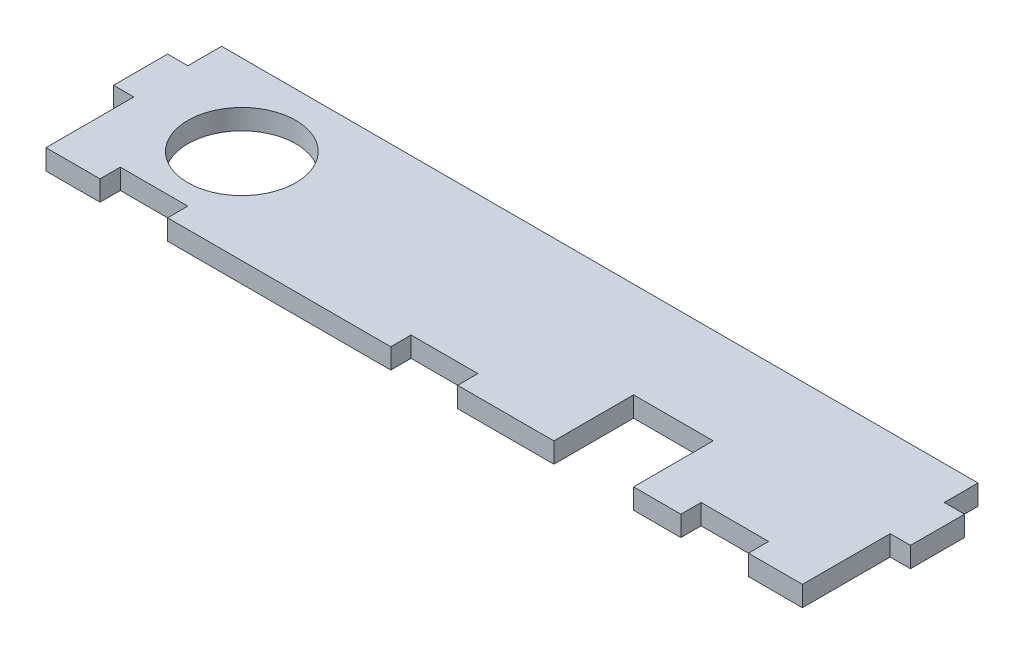
ISO-10303-21;
HEADER;
FILE_DESCRIPTION(('STEP AP214'),'2;1');
FILE_NAME('part.step','',(''),(''),'','','');
FILE_SCHEMA(('AUTOMOTIVE_DESIGN { 1 0 10303 214 1 1 1 1 }'));
ENDSEC;
DATA;
#1=APPLICATION_CONTEXT('core data for automotive mechanical design processes');
#2=APPLICATION_PROTOCOL_DEFINITION('international standard','automotive_design',2000,#1);
#3=PRODUCT_CONTEXT('',#1,'mechanical');
#4=PRODUCT('Part','Part','',(#3));
#5=PRODUCT_RELATED_PRODUCT_CATEGORY('part','',(#4));
#6=PRODUCT_DEFINITION_FORMATION('','',#4);
#7=PRODUCT_DEFINITION_CONTEXT('part definition',#1,'design');
#8=PRODUCT_DEFINITION('design','',#6,#7);
#9=PRODUCT_DEFINITION_SHAPE('','',#8);
#10=(LENGTH_UNIT() NAMED_UNIT(*) SI_UNIT(.MILLI.,.METRE.));
#11=(NAMED_UNIT(*) PLANE_ANGLE_UNIT() SI_UNIT($,.RADIAN.));
#12=(NAMED_UNIT(*) SI_UNIT($,.STERADIAN.) SOLID_ANGLE_UNIT());
#13=UNCERTAINTY_MEASURE_WITH_UNIT(LENGTH_MEASURE(1.E-05),#10,'distance_accuracy_value','');
#14=(GEOMETRIC_REPRESENTATION_CONTEXT(3) GLOBAL_UNCERTAINTY_ASSIGNED_CONTEXT((#13)) GLOBAL_UNIT_ASSIGNED_CONTEXT((#10,
#11,#12)) REPRESENTATION_CONTEXT('',''));
#15=CARTESIAN_POINT('',(0.,0.,0.));
#16=DIRECTION('',(0.,0.,1.));
#17=DIRECTION('',(1.,0.,0.));
#18=AXIS2_PLACEMENT_3D('',#15,#16,#17);
#19=CARTESIAN_POINT('',(0.,3.,0.));
#20=DIRECTION('',(0.,1.,0.));
#21=DIRECTION('',(0.,0.,1.));
#22=AXIS2_PLACEMENT_3D('',#19,#20,#21);
#23=PLANE('',#22);
#24=DIRECTION('',(1.,0.,0.));
#25=VECTOR('',#24,1.);
#26=CARTESIAN_POINT('',(1119.40812578582,3.,2442.39366866363));
#27=LINE('',#26,#25);
#28=CARTESIAN_POINT('',(1109.40812578582,3.,2442.39366866363));
#29=VERTEX_POINT('',#28);
#30=CARTESIAN_POINT('',(1119.40812578582,3.,2442.39366866363));
#31=VERTEX_POINT('',#30);
#32=EDGE_CURVE('E307',#29,#31,#27,.T.);
#33=ORIENTED_EDGE('',*,*,#32,.T.);
#34=DIRECTION('',(0.,0.,1.));
#35=VECTOR('',#34,1.);
#36=CARTESIAN_POINT('',(1119.40812578582,3.,2445.39366866363));
#37=LINE('',#36,#35);
#38=CARTESIAN_POINT('',(1119.40812578582,3.,2445.39366866363));
#39=VERTEX_POINT('',#38);
#40=EDGE_CURVE('E155',#31,#39,#37,.T.);
#41=ORIENTED_EDGE('',*,*,#40,.T.);
#42=DIRECTION('',(1.,0.,0.));
#43=VECTOR('',#42,1.);
#44=CARTESIAN_POINT('',(1119.40812578582,3.,2445.39366866363));
#45=LINE('',#44,#43);
#46=CARTESIAN_POINT('',(1152.45812578582,3.,2445.39366866363));
#47=VERTEX_POINT('',#46);
#48=EDGE_CURVE('E382',#39,#47,#45,.T.);
#49=ORIENTED_EDGE('',*,*,#48,.T.);
#50=DIRECTION('',(0.,0.,-1.));
#51=VECTOR('',#50,1.);
#52=CARTESIAN_POINT('',(1152.45812578582,3.,2445.39366866363));
#53=LINE('',#52,#51);
#54=CARTESIAN_POINT('',(1152.45812578582,3.,2442.39366866363));
#55=VERTEX_POINT('',#54);
#56=EDGE_CURVE('E401',#47,#55,#53,.T.);
#57=ORIENTED_EDGE('',*,*,#56,.T.);
#58=DIRECTION('',(1.,0.,0.));
#59=VECTOR('',#58,1.);
#60=CARTESIAN_POINT('',(1152.45812578582,3.,2442.39366866363));
#61=LINE('',#60,#59);
#62=CARTESIAN_POINT('',(1162.35812578582,3.,2442.39366866363));
#63=VERTEX_POINT('',#62);
#64=EDGE_CURVE('E398',#55,#63,#61,.T.);
#65=ORIENTED_EDGE('',*,*,#64,.T.);
#66=DIRECTION('',(0.,0.,1.));
#67=VECTOR('',#66,1.);
#68=CARTESIAN_POINT('',(1162.35812578582,3.,2442.39366866363));
#69=LINE('',#68,#67);
#70=CARTESIAN_POINT('',(1162.35812578582,3.,2445.39366866363));
#71=VERTEX_POINT('',#70);
#72=EDGE_CURVE('E400',#63,#71,#69,.T.);
#73=ORIENTED_EDGE('',*,*,#72,.T.);
#74=DIRECTION('',(1.,0.,0.));
#75=VECTOR('',#74,1.);
#76=CARTESIAN_POINT('',(1162.35812578582,3.,2445.39366866363));
#77=LINE('',#76,#75);
#78=CARTESIAN_POINT('',(1176.60812578582,3.,2445.39366866363));
#79=VERTEX_POINT('',#78);
#80=EDGE_CURVE('E403',#71,#79,#77,.T.);
#81=ORIENTED_EDGE('',*,*,#80,.T.);
#82=DIRECTION('',(0.,0.,-1.));
#83=VECTOR('',#82,1.);
#84=CARTESIAN_POINT('',(1176.60812578582,3.,2433.59366866363));
#85=LINE('',#84,#83);
#86=CARTESIAN_POINT('',(1176.60812578582,3.,2433.59366866363));
#87=VERTEX_POINT('',#86);
#88=EDGE_CURVE('E409',#79,#87,#85,.T.);
#89=ORIENTED_EDGE('',*,*,#88,.T.);
#90=DIRECTION('',(1.,0.,0.));
#91=VECTOR('',#90,1.);
#92=CARTESIAN_POINT('',(1176.60812578582,3.,2433.59366866363));
#93=LINE('',#92,#91);
#94=CARTESIAN_POINT('',(1188.40812578582,3.,2433.59366866363));
#95=VERTEX_POINT('',#94);
#96=EDGE_CURVE('E411',#87,#95,#93,.T.);
#97=ORIENTED_EDGE('',*,*,#96,.T.);
#98=DIRECTION('',(0.,0.,1.));
#99=VECTOR('',#98,1.);
#100=CARTESIAN_POINT('',(1188.40812578582,3.,2433.59366866363));
#101=LINE('',#100,#99);
#102=CARTESIAN_POINT('',(1188.40812578582,3.,2445.39366866363));
#103=VERTEX_POINT('',#102);
#104=EDGE_CURVE('E413',#95,#103,#101,.T.);
#105=ORIENTED_EDGE('',*,*,#104,.T.);
#106=DIRECTION('',(1.,0.,0.));
#107=VECTOR('',#106,1.);
#108=CARTESIAN_POINT('',(1188.40812578582,3.,2445.39366866363));
#109=LINE('',#108,#107);
#110=CARTESIAN_POINT('',(1195.40812578582,3.,2445.39366866363));
#111=VERTEX_POINT('',#110);
#112=EDGE_CURVE('E415',#103,#111,#109,.T.);
#113=ORIENTED_EDGE('',*,*,#112,.T.);
#114=DIRECTION('',(0.,0.,-1.));
#115=VECTOR('',#114,1.);
#116=CARTESIAN_POINT('',(1195.40812578582,3.,2445.39366866363));
#117=LINE('',#116,#115);
#118=CARTESIAN_POINT('',(1195.40812578582,3.,2442.39366866363));
#119=VERTEX_POINT('',#118);
#120=EDGE_CURVE('E417',#111,#119,#117,.T.);
#121=ORIENTED_EDGE('',*,*,#120,.T.);
#122=DIRECTION('',(1.,0.,0.));
#123=VECTOR('',#122,1.);
#124=CARTESIAN_POINT('',(1195.40812578582,3.,2442.39366866363));
#125=LINE('',#124,#123);
#126=CARTESIAN_POINT('',(1205.40812578582,3.,2442.39366866363));
#127=VERTEX_POINT('',#126);
#128=EDGE_CURVE('E419',#119,#127,#125,.T.);
#129=ORIENTED_EDGE('',*,*,#128,.T.);
#130=DIRECTION('',(0.,0.,1.));
#131=VECTOR('',#130,1.);
#132=CARTESIAN_POINT('',(1205.40812578582,3.,2442.39366866363));
#133=LINE('',#132,#131);
#134=CARTESIAN_POINT('',(1205.40812578582,3.,2445.39366866363));
#135=VERTEX_POINT('',#134);
#136=EDGE_CURVE('E421',#127,#135,#133,.T.);
#137=ORIENTED_EDGE('',*,*,#136,.T.);
#138=DIRECTION('',(1.,0.,0.));
#139=VECTOR('',#138,1.);
#140=CARTESIAN_POINT('',(1205.40812578582,3.,2445.39366866363));
#141=LINE('',#140,#139);
#142=CARTESIAN_POINT('',(1213.40812578582,3.,2445.39366866363));
#143=VERTEX_POINT('',#142);
#144=EDGE_CURVE('E423',#135,#143,#141,.T.);
#145=ORIENTED_EDGE('',*,*,#144,.T.);
#146=DIRECTION('',(0.,0.,-1.));
#147=VECTOR('',#146,1.);
#148=CARTESIAN_POINT('',(1213.40812578582,3.,2432.39366866363));
#149=LINE('',#148,#147);
#150=CARTESIAN_POINT('',(1213.40812578582,3.,2432.39366866363));
#151=VERTEX_POINT('',#150);
#152=EDGE_CURVE('E425',#143,#151,#149,.T.);
#153=ORIENTED_EDGE('',*,*,#152,.T.);
#154=DIRECTION('',(1.,0.,0.));
#155=VECTOR('',#154,1.);
#156=CARTESIAN_POINT('',(1213.40812578582,3.,2432.39366866363));
#157=LINE('',#156,#155);
#158=CARTESIAN_POINT('',(1216.40812578582,3.,2432.39366866363));
#159=VERTEX_POINT('',#158);
#160=EDGE_CURVE('E427',#151,#159,#157,.T.);
#161=ORIENTED_EDGE('',*,*,#160,.T.);
#162=DIRECTION('',(0.,0.,-1.));
#163=VECTOR('',#162,1.);
#164=CARTESIAN_POINT('',(1216.40812578582,3.,2432.39366866363));
#165=LINE('',#164,#163);
#166=CARTESIAN_POINT('',(1216.40812578582,3.,2424.39366866363));
#167=VERTEX_POINT('',#166);
#168=EDGE_CURVE('E429',#159,#167,#165,.T.);
#169=ORIENTED_EDGE('',*,*,#168,.T.);
#170=DIRECTION('',(-1.,0.,0.));
#171=VECTOR('',#170,1.);
#172=CARTESIAN_POINT('',(1216.40812578582,3.,2424.39366866363));
#173=LINE('',#172,#171);
#174=CARTESIAN_POINT('',(1213.40812578582,3.,2424.39366866363));
#175=VERTEX_POINT('',#174);
#176=EDGE_CURVE('E431',#167,#175,#173,.T.);
#177=ORIENTED_EDGE('',*,*,#176,.T.);
#178=DIRECTION('',(0.,0.,-1.));
#179=VECTOR('',#178,1.);
#180=CARTESIAN_POINT('',(1213.40812578582,3.,2419.39366866363));
#181=LINE('',#180,#179);
#182=CARTESIAN_POINT('',(1213.40812578582,3.,2419.39366866363));
#183=VERTEX_POINT('',#182);
#184=EDGE_CURVE('E433',#175,#183,#181,.T.);
#185=ORIENTED_EDGE('',*,*,#184,.T.);
#186=DIRECTION('',(-1.,0.,0.));
#187=VECTOR('',#186,1.);
#188=CARTESIAN_POINT('',(1101.40812578582,3.,2419.39366866363));
#189=LINE('',#188,#187);
#190=CARTESIAN_POINT('',(1101.40812578582,3.,2419.39366866363));
#191=VERTEX_POINT('',#190);
#192=EDGE_CURVE('E435',#183,#191,#189,.T.);
#193=ORIENTED_EDGE('',*,*,#192,.T.);
#194=DIRECTION('',(0.,0.,1.));
#195=VECTOR('',#194,1.);
#196=CARTESIAN_POINT('',(1101.40812578582,3.,2419.39366866363));
#197=LINE('',#196,#195);
#198=CARTESIAN_POINT('',(1101.40812578582,3.,2424.39366866363));
#199=VERTEX_POINT('',#198);
#200=EDGE_CURVE('E437',#191,#199,#197,.T.);
#201=ORIENTED_EDGE('',*,*,#200,.T.);
#202=DIRECTION('',(-1.,0.,0.));
#203=VECTOR('',#202,1.);
#204=CARTESIAN_POINT('',(1098.40812578582,3.,2424.39366866363));
#205=LINE('',#204,#203);
#206=CARTESIAN_POINT('',(1098.40812578582,3.,2424.39366866363));
#207=VERTEX_POINT('',#206);
#208=EDGE_CURVE('E439',#199,#207,#205,.T.);
#209=ORIENTED_EDGE('',*,*,#208,.T.);
#210=DIRECTION('',(0.,0.,1.));
#211=VECTOR('',#210,1.);
#212=CARTESIAN_POINT('',(1098.40812578582,3.,2432.39366866363));
#213=LINE('',#212,#211);
#214=CARTESIAN_POINT('',(1098.40812578582,3.,2432.39366866363));
#215=VERTEX_POINT('',#214);
#216=EDGE_CURVE('E441',#207,#215,#213,.T.);
#217=ORIENTED_EDGE('',*,*,#216,.T.);
#218=DIRECTION('',(1.,0.,0.));
#219=VECTOR('',#218,1.);
#220=CARTESIAN_POINT('',(1101.40812578582,3.,2432.39366866363));
#221=LINE('',#220,#219);
#222=CARTESIAN_POINT('',(1101.40812578582,3.,2432.39366866363));
#223=VERTEX_POINT('',#222);
#224=EDGE_CURVE('E234',#215,#223,#221,.T.);
#225=ORIENTED_EDGE('',*,*,#224,.T.);
#226=DIRECTION('',(0.,0.,1.));
#227=VECTOR('',#226,1.);
#228=CARTESIAN_POINT('',(1101.40812578582,3.,2432.39366866363));
#229=LINE('',#228,#227);
#230=CARTESIAN_POINT('',(1101.40812578582,3.,2445.39366866363));
#231=VERTEX_POINT('',#230);
#232=EDGE_CURVE('E228',#223,#231,#229,.T.);
#233=ORIENTED_EDGE('',*,*,#232,.T.);
#234=DIRECTION('',(1.,0.,0.));
#235=VECTOR('',#234,1.);
#236=CARTESIAN_POINT('',(1109.40812578582,3.,2445.39366866363));
#237=LINE('',#236,#235);
#238=CARTESIAN_POINT('',(1109.40812578582,3.,2445.39366866363));
#239=VERTEX_POINT('',#238);
#240=EDGE_CURVE('E232',#231,#239,#237,.T.);
#241=ORIENTED_EDGE('',*,*,#240,.T.);
#242=DIRECTION('',(0.,0.,-1.));
#243=VECTOR('',#242,1.);
#244=CARTESIAN_POINT('',(1109.40812578582,3.,2442.39366866363));
#245=LINE('',#244,#243);
#246=EDGE_CURVE('E52',#239,#29,#245,.T.);
#247=ORIENTED_EDGE('',*,*,#246,.T.);
#248=EDGE_LOOP('',(#33,#41,#49,#57,#65,#73,#81,#89,#97,#105,#113,#121,#129,#137,#145,#153,#161,
#169,#177,#185,#193,#201,#209,#217,#225,#233,#241,#247));
#249=FACE_BOUND('',#248,.T.);
#250=CARTESIAN_POINT('',(1116.40812578582,3.,2431.39366866363));
#251=DIRECTION('',(0.,1.,0.));
#252=DIRECTION('',(0.,0.,1.));
#253=AXIS2_PLACEMENT_3D('',#250,#251,#252);
#254=CIRCLE('',#253,7.99999999999999);
#255=CARTESIAN_POINT('',(1116.40812578582,3.,2439.39366866363));
#256=VERTEX_POINT('',#255);
#257=EDGE_CURVE('E256',#256,#256,#254,.T.);
#258=ORIENTED_EDGE('',*,*,#257,.F.);
#259=EDGE_LOOP('',(#258));
#260=FACE_BOUND('',#259,.T.);
#261=ADVANCED_FACE('F35',(#249,#260),#23,.T.);
#262=CARTESIAN_POINT('',(0.,0.,0.));
#263=DIRECTION('',(0.,1.,0.));
#264=DIRECTION('',(0.,0.,1.));
#265=AXIS2_PLACEMENT_3D('',#262,#263,#264);
#266=PLANE('',#265);
#267=DIRECTION('',(1.,0.,0.));
#268=VECTOR('',#267,1.);
#269=CARTESIAN_POINT('',(1119.40812578582,0.,2442.39366866363));
#270=LINE('',#269,#268);
#271=CARTESIAN_POINT('',(1109.40812578582,0.,2442.39366866363));
#272=VERTEX_POINT('',#271);
#273=CARTESIAN_POINT('',(1119.40812578582,0.,2442.39366866363));
#274=VERTEX_POINT('',#273);
#275=EDGE_CURVE('E252',#272,#274,#270,.T.);
#276=ORIENTED_EDGE('',*,*,#275,.F.);
#277=DIRECTION('',(0.,0.,-1.));
#278=VECTOR('',#277,1.);
#279=CARTESIAN_POINT('',(1109.40812578582,0.,2442.39366866363));
#280=LINE('',#279,#278);
#281=CARTESIAN_POINT('',(1109.40812578582,0.,2445.39366866363));
#282=VERTEX_POINT('',#281);
#283=EDGE_CURVE('E147',#282,#272,#280,.T.);
#284=ORIENTED_EDGE('',*,*,#283,.F.);
#285=DIRECTION('',(1.,0.,0.));
#286=VECTOR('',#285,1.);
#287=CARTESIAN_POINT('',(1109.40812578582,0.,2445.39366866363));
#288=LINE('',#287,#286);
#289=CARTESIAN_POINT('',(1101.40812578582,0.,2445.39366866363));
#290=VERTEX_POINT('',#289);
#291=EDGE_CURVE('E141',#290,#282,#288,.T.);
#292=ORIENTED_EDGE('',*,*,#291,.F.);
#293=DIRECTION('',(0.,0.,1.));
#294=VECTOR('',#293,1.);
#295=CARTESIAN_POINT('',(1101.40812578582,0.,2432.39366866363));
#296=LINE('',#295,#294);
#297=CARTESIAN_POINT('',(1101.40812578582,0.,2432.39366866363));
#298=VERTEX_POINT('',#297);
#299=EDGE_CURVE('E242',#298,#290,#296,.T.);
#300=ORIENTED_EDGE('',*,*,#299,.F.);
#301=DIRECTION('',(1.,0.,0.));
#302=VECTOR('',#301,1.);
#303=CARTESIAN_POINT('',(1101.40812578582,0.,2432.39366866363));
#304=LINE('',#303,#302);
#305=CARTESIAN_POINT('',(1098.40812578582,0.,2432.39366866363));
#306=VERTEX_POINT('',#305);
#307=EDGE_CURVE('E302',#306,#298,#304,.T.);
#308=ORIENTED_EDGE('',*,*,#307,.F.);
#309=DIRECTION('',(0.,0.,1.));
#310=VECTOR('',#309,1.);
#311=CARTESIAN_POINT('',(1098.40812578582,0.,2432.39366866363));
#312=LINE('',#311,#310);
#313=CARTESIAN_POINT('',(1098.40812578582,0.,2424.39366866363));
#314=VERTEX_POINT('',#313);
#315=EDGE_CURVE('E300',#314,#306,#312,.T.);
#316=ORIENTED_EDGE('',*,*,#315,.F.);
#317=DIRECTION('',(-1.,0.,0.));
#318=VECTOR('',#317,1.);
#319=CARTESIAN_POINT('',(1098.40812578582,0.,2424.39366866363));
#320=LINE('',#319,#318);
#321=CARTESIAN_POINT('',(1101.40812578582,0.,2424.39366866363));
#322=VERTEX_POINT('',#321);
#323=EDGE_CURVE('E298',#322,#314,#320,.T.);
#324=ORIENTED_EDGE('',*,*,#323,.F.);
#325=DIRECTION('',(0.,0.,1.));
#326=VECTOR('',#325,1.);
#327=CARTESIAN_POINT('',(1101.40812578582,0.,2419.39366866363));
#328=LINE('',#327,#326);
#329=CARTESIAN_POINT('',(1101.40812578582,0.,2419.39366866363));
#330=VERTEX_POINT('',#329);
#331=EDGE_CURVE('E296',#330,#322,#328,.T.);
#332=ORIENTED_EDGE('',*,*,#331,.F.);
#333=DIRECTION('',(-1.,0.,0.));
#334=VECTOR('',#333,1.);
#335=CARTESIAN_POINT('',(1101.40812578582,0.,2419.39366866363));
#336=LINE('',#335,#334);
#337=CARTESIAN_POINT('',(1213.40812578582,0.,2419.39366866363));
#338=VERTEX_POINT('',#337);
#339=EDGE_CURVE('E294',#338,#330,#336,.T.);
#340=ORIENTED_EDGE('',*,*,#339,.F.);
#341=DIRECTION('',(0.,0.,-1.));
#342=VECTOR('',#341,1.);
#343=CARTESIAN_POINT('',(1213.40812578582,0.,2419.39366866363));
#344=LINE('',#343,#342);
#345=CARTESIAN_POINT('',(1213.40812578582,0.,2424.39366866363));
#346=VERTEX_POINT('',#345);
#347=EDGE_CURVE('E292',#346,#338,#344,.T.);
#348=ORIENTED_EDGE('',*,*,#347,.F.);
#349=DIRECTION('',(-1.,0.,0.));
#350=VECTOR('',#349,1.);
#351=CARTESIAN_POINT('',(1216.40812578582,0.,2424.39366866363));
#352=LINE('',#351,#350);
#353=CARTESIAN_POINT('',(1216.40812578582,0.,2424.39366866363));
#354=VERTEX_POINT('',#353);
#355=EDGE_CURVE('E290',#354,#346,#352,.T.);
#356=ORIENTED_EDGE('',*,*,#355,.F.);
#357=DIRECTION('',(0.,0.,-1.));
#358=VECTOR('',#357,1.);
#359=CARTESIAN_POINT('',(1216.40812578582,0.,2432.39366866363));
#360=LINE('',#359,#358);
#361=CARTESIAN_POINT('',(1216.40812578582,0.,2432.39366866363));
#362=VERTEX_POINT('',#361);
#363=EDGE_CURVE('E288',#362,#354,#360,.T.);
#364=ORIENTED_EDGE('',*,*,#363,.F.);
#365=DIRECTION('',(1.,0.,0.));
#366=VECTOR('',#365,1.);
#367=CARTESIAN_POINT('',(1213.40812578582,0.,2432.39366866363));
#368=LINE('',#367,#366);
#369=CARTESIAN_POINT('',(1213.40812578582,0.,2432.39366866363));
#370=VERTEX_POINT('',#369);
#371=EDGE_CURVE('E286',#370,#362,#368,.T.);
#372=ORIENTED_EDGE('',*,*,#371,.F.);
#373=DIRECTION('',(0.,0.,-1.));
#374=VECTOR('',#373,1.);
#375=CARTESIAN_POINT('',(1213.40812578582,0.,2432.39366866363));
#376=LINE('',#375,#374);
#377=CARTESIAN_POINT('',(1213.40812578582,0.,2445.39366866363));
#378=VERTEX_POINT('',#377);
#379=EDGE_CURVE('E284',#378,#370,#376,.T.);
#380=ORIENTED_EDGE('',*,*,#379,.F.);
#381=DIRECTION('',(1.,0.,0.));
#382=VECTOR('',#381,1.);
#383=CARTESIAN_POINT('',(1205.40812578582,0.,2445.39366866363));
#384=LINE('',#383,#382);
#385=CARTESIAN_POINT('',(1205.40812578582,0.,2445.39366866363));
#386=VERTEX_POINT('',#385);
#387=EDGE_CURVE('E282',#386,#378,#384,.T.);
#388=ORIENTED_EDGE('',*,*,#387,.F.);
#389=DIRECTION('',(0.,0.,1.));
#390=VECTOR('',#389,1.);
#391=CARTESIAN_POINT('',(1205.40812578582,0.,2442.39366866363));
#392=LINE('',#391,#390);
#393=CARTESIAN_POINT('',(1205.40812578582,0.,2442.39366866363));
#394=VERTEX_POINT('',#393);
#395=EDGE_CURVE('E280',#394,#386,#392,.T.);
#396=ORIENTED_EDGE('',*,*,#395,.F.);
#397=DIRECTION('',(1.,0.,0.));
#398=VECTOR('',#397,1.);
#399=CARTESIAN_POINT('',(1195.40812578582,0.,2442.39366866363));
#400=LINE('',#399,#398);
#401=CARTESIAN_POINT('',(1195.40812578582,0.,2442.39366866363));
#402=VERTEX_POINT('',#401);
#403=EDGE_CURVE('E278',#402,#394,#400,.T.);
#404=ORIENTED_EDGE('',*,*,#403,.F.);
#405=DIRECTION('',(0.,0.,-1.));
#406=VECTOR('',#405,1.);
#407=CARTESIAN_POINT('',(1195.40812578582,0.,2445.39366866363));
#408=LINE('',#407,#406);
#409=CARTESIAN_POINT('',(1195.40812578582,0.,2445.39366866363));
#410=VERTEX_POINT('',#409);
#411=EDGE_CURVE('E276',#410,#402,#408,.T.);
#412=ORIENTED_EDGE('',*,*,#411,.F.);
#413=DIRECTION('',(1.,0.,0.));
#414=VECTOR('',#413,1.);
#415=CARTESIAN_POINT('',(1188.40812578582,0.,2445.39366866363));
#416=LINE('',#415,#414);
#417=CARTESIAN_POINT('',(1188.40812578582,0.,2445.39366866363));
#418=VERTEX_POINT('',#417);
#419=EDGE_CURVE('E274',#418,#410,#416,.T.);
#420=ORIENTED_EDGE('',*,*,#419,.F.);
#421=DIRECTION('',(0.,0.,1.));
#422=VECTOR('',#421,1.);
#423=CARTESIAN_POINT('',(1188.40812578582,0.,2433.59366866363));
#424=LINE('',#423,#422);
#425=CARTESIAN_POINT('',(1188.40812578582,0.,2433.59366866363));
#426=VERTEX_POINT('',#425);
#427=EDGE_CURVE('E272',#426,#418,#424,.T.);
#428=ORIENTED_EDGE('',*,*,#427,.F.);
#429=DIRECTION('',(1.,0.,0.));
#430=VECTOR('',#429,1.);
#431=CARTESIAN_POINT('',(1176.60812578582,0.,2433.59366866363));
#432=LINE('',#431,#430);
#433=CARTESIAN_POINT('',(1176.60812578582,0.,2433.59366866363));
#434=VERTEX_POINT('',#433);
#435=EDGE_CURVE('E270',#434,#426,#432,.T.);
#436=ORIENTED_EDGE('',*,*,#435,.F.);
#437=DIRECTION('',(0.,0.,-1.));
#438=VECTOR('',#437,1.);
#439=CARTESIAN_POINT('',(1176.60812578582,0.,2433.59366866363));
#440=LINE('',#439,#438);
#441=CARTESIAN_POINT('',(1176.60812578582,0.,2445.39366866363));
#442=VERTEX_POINT('',#441);
#443=EDGE_CURVE('E268',#442,#434,#440,.T.);
#444=ORIENTED_EDGE('',*,*,#443,.F.);
#445=DIRECTION('',(1.,0.,0.));
#446=VECTOR('',#445,1.);
#447=CARTESIAN_POINT('',(1162.35812578582,0.,2445.39366866363));
#448=LINE('',#447,#446);
#449=CARTESIAN_POINT('',(1162.35812578582,0.,2445.39366866363));
#450=VERTEX_POINT('',#449);
#451=EDGE_CURVE('E266',#450,#442,#448,.T.);
#452=ORIENTED_EDGE('',*,*,#451,.F.);
#453=DIRECTION('',(0.,0.,1.));
#454=VECTOR('',#453,1.);
#455=CARTESIAN_POINT('',(1162.35812578582,0.,2442.39366866363));
#456=LINE('',#455,#454);
#457=CARTESIAN_POINT('',(1162.35812578582,0.,2442.39366866363));
#458=VERTEX_POINT('',#457);
#459=EDGE_CURVE('E264',#458,#450,#456,.T.);
#460=ORIENTED_EDGE('',*,*,#459,.F.);
#461=DIRECTION('',(1.,0.,0.));
#462=VECTOR('',#461,1.);
#463=CARTESIAN_POINT('',(1152.45812578582,0.,2442.39366866363));
#464=LINE('',#463,#462);
#465=CARTESIAN_POINT('',(1152.45812578582,0.,2442.39366866363));
#466=VERTEX_POINT('',#465);
#467=EDGE_CURVE('E262',#466,#458,#464,.T.);
#468=ORIENTED_EDGE('',*,*,#467,.F.);
#469=DIRECTION('',(0.,0.,-1.));
#470=VECTOR('',#469,1.);
#471=CARTESIAN_POINT('',(1152.45812578582,0.,2445.39366866363));
#472=LINE('',#471,#470);
#473=CARTESIAN_POINT('',(1152.45812578582,0.,2445.39366866363));
#474=VERTEX_POINT('',#473);
#475=EDGE_CURVE('E260',#474,#466,#472,.T.);
#476=ORIENTED_EDGE('',*,*,#475,.F.);
#477=DIRECTION('',(1.,0.,0.));
#478=VECTOR('',#477,1.);
#479=CARTESIAN_POINT('',(1119.40812578582,0.,2445.39366866363));
#480=LINE('',#479,#478);
#481=CARTESIAN_POINT('',(1119.40812578582,0.,2445.39366866363));
#482=VERTEX_POINT('',#481);
#483=EDGE_CURVE('E258',#482,#474,#480,.T.);
#484=ORIENTED_EDGE('',*,*,#483,.F.);
#485=DIRECTION('',(0.,0.,1.));
#486=VECTOR('',#485,1.);
#487=CARTESIAN_POINT('',(1119.40812578582,0.,2445.39366866363));
#488=LINE('',#487,#486);
#489=EDGE_CURVE('E255',#274,#482,#488,.T.);
#490=ORIENTED_EDGE('',*,*,#489,.F.);
#491=EDGE_LOOP('',(#276,#284,#292,#300,#308,#316,#324,#332,#340,#348,#356,#364,#372,#380,#388,
#396,#404,#412,#420,#428,#436,#444,#452,#460,#468,#476,#484,#490));
#492=FACE_BOUND('',#491,.T.);
#493=CARTESIAN_POINT('',(1116.40812578582,0.,2431.39366866363));
#494=DIRECTION('',(0.,1.,0.));
#495=DIRECTION('',(0.,0.,1.));
#496=AXIS2_PLACEMENT_3D('',#493,#494,#495);
#497=CIRCLE('',#496,7.99999999999999);
#498=CARTESIAN_POINT('',(1116.40812578582,0.,2439.39366866363));
#499=VERTEX_POINT('',#498);
#500=EDGE_CURVE('E796',#499,#499,#497,.T.);
#501=ORIENTED_EDGE('',*,*,#500,.T.);
#502=EDGE_LOOP('',(#501));
#503=FACE_BOUND('',#502,.T.);
#504=ADVANCED_FACE('F386',(#492,#503),#266,.F.);
#505=CARTESIAN_POINT('',(1119.40812578582,3.,2442.39366866363));
#506=DIRECTION('',(0.,0.,-1.));
#507=DIRECTION('',(-1.,0.,0.));
#508=AXIS2_PLACEMENT_3D('',#505,#506,#507);
#509=PLANE('',#508);
#510=ORIENTED_EDGE('',*,*,#275,.T.);
#511=DIRECTION('',(0.,-1.,0.));
#512=VECTOR('',#511,1.);
#513=CARTESIAN_POINT('',(1119.40812578582,3.,2442.39366866363));
#514=LINE('',#513,#512);
#515=EDGE_CURVE('E11',#31,#274,#514,.T.);
#516=ORIENTED_EDGE('',*,*,#515,.F.);
#517=ORIENTED_EDGE('',*,*,#32,.F.);
#518=DIRECTION('',(0.,-1.,0.));
#519=VECTOR('',#518,1.);
#520=CARTESIAN_POINT('',(1109.40812578582,3.,2442.39366866363));
#521=LINE('',#520,#519);
#522=EDGE_CURVE('E248',#29,#272,#521,.T.);
#523=ORIENTED_EDGE('',*,*,#522,.T.);
#524=EDGE_LOOP('',(#510,#516,#517,#523));
#525=FACE_BOUND('',#524,.T.);
#526=ADVANCED_FACE('F37',(#525),#509,.F.);
#527=CARTESIAN_POINT('',(1119.40812578582,3.,2445.39366866363));
#528=DIRECTION('',(1.,0.,0.));
#529=DIRECTION('',(0.,0.,-1.));
#530=AXIS2_PLACEMENT_3D('',#527,#528,#529);
#531=PLANE('',#530);
#532=ORIENTED_EDGE('',*,*,#489,.T.);
#533=DIRECTION('',(0.,-1.,0.));
#534=VECTOR('',#533,1.);
#535=CARTESIAN_POINT('',(1119.40812578582,3.,2445.39366866363));
#536=LINE('',#535,#534);
#537=EDGE_CURVE('E44',#39,#482,#536,.T.);
#538=ORIENTED_EDGE('',*,*,#537,.F.);
#539=ORIENTED_EDGE('',*,*,#40,.F.);
#540=ORIENTED_EDGE('',*,*,#515,.T.);
#541=EDGE_LOOP('',(#532,#538,#539,#540));
#542=FACE_BOUND('',#541,.T.);
#543=ADVANCED_FACE('F475',(#542),#531,.F.);
#544=CARTESIAN_POINT('',(1119.40812578582,3.,2445.39366866363));
#545=DIRECTION('',(0.,0.,-1.));
#546=DIRECTION('',(-1.,0.,0.));
#547=AXIS2_PLACEMENT_3D('',#544,#545,#546);
#548=PLANE('',#547);
#549=ORIENTED_EDGE('',*,*,#483,.T.);
#550=DIRECTION('',(0.,-1.,0.));
#551=VECTOR('',#550,1.);
#552=CARTESIAN_POINT('',(1152.45812578582,3.,2445.39366866363));
#553=LINE('',#552,#551);
#554=EDGE_CURVE('E374',#47,#474,#553,.T.);
#555=ORIENTED_EDGE('',*,*,#554,.F.);
#556=ORIENTED_EDGE('',*,*,#48,.F.);
#557=ORIENTED_EDGE('',*,*,#537,.T.);
#558=EDGE_LOOP('',(#549,#555,#556,#557));
#559=FACE_BOUND('',#558,.T.);
#560=ADVANCED_FACE('F380',(#559),#548,.F.);
#561=CARTESIAN_POINT('',(1152.45812578582,3.,2445.39366866363));
#562=DIRECTION('',(-1.,0.,0.));
#563=DIRECTION('',(0.,0.,1.));
#564=AXIS2_PLACEMENT_3D('',#561,#562,#563);
#565=PLANE('',#564);
#566=ORIENTED_EDGE('',*,*,#475,.T.);
#567=DIRECTION('',(0.,-1.,0.));
#568=VECTOR('',#567,1.);
#569=CARTESIAN_POINT('',(1152.45812578582,3.,2442.39366866363));
#570=LINE('',#569,#568);
#571=EDGE_CURVE('E371',#55,#466,#570,.T.);
#572=ORIENTED_EDGE('',*,*,#571,.F.);
#573=ORIENTED_EDGE('',*,*,#56,.F.);
#574=ORIENTED_EDGE('',*,*,#554,.T.);
#575=EDGE_LOOP('',(#566,#572,#573,#574));
#576=FACE_BOUND('',#575,.T.);
#577=ADVANCED_FACE('F392',(#576),#565,.F.);
#578=CARTESIAN_POINT('',(1152.45812578582,3.,2442.39366866363));
#579=DIRECTION('',(0.,0.,-1.));
#580=DIRECTION('',(-1.,0.,0.));
#581=AXIS2_PLACEMENT_3D('',#578,#579,#580);
#582=PLANE('',#581);
#583=ORIENTED_EDGE('',*,*,#467,.T.);
#584=DIRECTION('',(0.,-1.,0.));
#585=VECTOR('',#584,1.);
#586=CARTESIAN_POINT('',(1162.35812578582,3.,2442.39366866363));
#587=LINE('',#586,#585);
#588=EDGE_CURVE('E368',#63,#458,#587,.T.);
#589=ORIENTED_EDGE('',*,*,#588,.F.);
#590=ORIENTED_EDGE('',*,*,#64,.F.);
#591=ORIENTED_EDGE('',*,*,#571,.T.);
#592=EDGE_LOOP('',(#583,#589,#590,#591));
#593=FACE_BOUND('',#592,.T.);
#594=ADVANCED_FACE('F396',(#593),#582,.F.);
#595=CARTESIAN_POINT('',(1162.35812578582,3.,2442.39366866363));
#596=DIRECTION('',(1.,0.,0.));
#597=DIRECTION('',(0.,0.,-1.));
#598=AXIS2_PLACEMENT_3D('',#595,#596,#597);
#599=PLANE('',#598);
#600=ORIENTED_EDGE('',*,*,#459,.T.);
#601=DIRECTION('',(0.,-1.,0.));
#602=VECTOR('',#601,1.);
#603=CARTESIAN_POINT('',(1162.35812578582,3.,2445.39366866363));
#604=LINE('',#603,#602);
#605=EDGE_CURVE('E365',#71,#450,#604,.T.);
#606=ORIENTED_EDGE('',*,*,#605,.F.);
#607=ORIENTED_EDGE('',*,*,#72,.F.);
#608=ORIENTED_EDGE('',*,*,#588,.T.);
#609=EDGE_LOOP('',(#600,#606,#607,#608));
#610=FACE_BOUND('',#609,.T.);
#611=ADVANCED_FACE('F488',(#610),#599,.F.);
#612=CARTESIAN_POINT('',(1162.35812578582,3.,2445.39366866363));
#613=DIRECTION('',(0.,0.,-1.));
#614=DIRECTION('',(-1.,0.,0.));
#615=AXIS2_PLACEMENT_3D('',#612,#613,#614);
#616=PLANE('',#615);
#617=ORIENTED_EDGE('',*,*,#451,.T.);
#618=DIRECTION('',(0.,-1.,0.));
#619=VECTOR('',#618,1.);
#620=CARTESIAN_POINT('',(1176.60812578582,3.,2445.39366866363));
#621=LINE('',#620,#619);
#622=EDGE_CURVE('E362',#79,#442,#621,.T.);
#623=ORIENTED_EDGE('',*,*,#622,.F.);
#624=ORIENTED_EDGE('',*,*,#80,.F.);
#625=ORIENTED_EDGE('',*,*,#605,.T.);
#626=EDGE_LOOP('',(#617,#623,#624,#625));
#627=FACE_BOUND('',#626,.T.);
#628=ADVANCED_FACE('F491',(#627),#616,.F.);
#629=CARTESIAN_POINT('',(1176.60812578582,3.,2433.59366866363));
#630=DIRECTION('',(-1.,0.,0.));
#631=DIRECTION('',(0.,0.,1.));
#632=AXIS2_PLACEMENT_3D('',#629,#630,#631);
#633=PLANE('',#632);
#634=ORIENTED_EDGE('',*,*,#443,.T.);
#635=DIRECTION('',(0.,-1.,0.));
#636=VECTOR('',#635,1.);
#637=CARTESIAN_POINT('',(1176.60812578582,3.,2433.59366866363));
#638=LINE('',#637,#636);
#639=EDGE_CURVE('E359',#87,#434,#638,.T.);
#640=ORIENTED_EDGE('',*,*,#639,.F.);
#641=ORIENTED_EDGE('',*,*,#88,.F.);
#642=ORIENTED_EDGE('',*,*,#622,.T.);
#643=EDGE_LOOP('',(#634,#640,#641,#642));
#644=FACE_BOUND('',#643,.T.);
#645=ADVANCED_FACE('F495',(#644),#633,.F.);
#646=CARTESIAN_POINT('',(1176.60812578582,3.,2433.59366866363));
#647=DIRECTION('',(0.,0.,-1.));
#648=DIRECTION('',(-1.,0.,0.));
#649=AXIS2_PLACEMENT_3D('',#646,#647,#648);
#650=PLANE('',#649);
#651=ORIENTED_EDGE('',*,*,#435,.T.);
#652=DIRECTION('',(0.,-1.,0.));
#653=VECTOR('',#652,1.);
#654=CARTESIAN_POINT('',(1188.40812578582,3.,2433.59366866363));
#655=LINE('',#654,#653);
#656=EDGE_CURVE('E356',#95,#426,#655,.T.);
#657=ORIENTED_EDGE('',*,*,#656,.F.);
#658=ORIENTED_EDGE('',*,*,#96,.F.);
#659=ORIENTED_EDGE('',*,*,#639,.T.);
#660=EDGE_LOOP('',(#651,#657,#658,#659));
#661=FACE_BOUND('',#660,.T.);
#662=ADVANCED_FACE('F499',(#661),#650,.F.);
#663=CARTESIAN_POINT('',(1188.40812578582,3.,2433.59366866363));
#664=DIRECTION('',(1.,0.,0.));
#665=DIRECTION('',(0.,0.,-1.));
#666=AXIS2_PLACEMENT_3D('',#663,#664,#665);
#667=PLANE('',#666);
#668=ORIENTED_EDGE('',*,*,#427,.T.);
#669=DIRECTION('',(0.,-1.,0.));
#670=VECTOR('',#669,1.);
#671=CARTESIAN_POINT('',(1188.40812578582,3.,2445.39366866363));
#672=LINE('',#671,#670);
#673=EDGE_CURVE('E353',#103,#418,#672,.T.);
#674=ORIENTED_EDGE('',*,*,#673,.F.);
#675=ORIENTED_EDGE('',*,*,#104,.F.);
#676=ORIENTED_EDGE('',*,*,#656,.T.);
#677=EDGE_LOOP('',(#668,#674,#675,#676));
#678=FACE_BOUND('',#677,.T.);
#679=ADVANCED_FACE('F503',(#678),#667,.F.);
#680=CARTESIAN_POINT('',(1188.40812578582,3.,2445.39366866363));
#681=DIRECTION('',(0.,0.,-1.));
#682=DIRECTION('',(-1.,0.,0.));
#683=AXIS2_PLACEMENT_3D('',#680,#681,#682);
#684=PLANE('',#683);
#685=ORIENTED_EDGE('',*,*,#419,.T.);
#686=DIRECTION('',(0.,-1.,0.));
#687=VECTOR('',#686,1.);
#688=CARTESIAN_POINT('',(1195.40812578582,3.,2445.39366866363));
#689=LINE('',#688,#687);
#690=EDGE_CURVE('E350',#111,#410,#689,.T.);
#691=ORIENTED_EDGE('',*,*,#690,.F.);
#692=ORIENTED_EDGE('',*,*,#112,.F.);
#693=ORIENTED_EDGE('',*,*,#673,.T.);
#694=EDGE_LOOP('',(#685,#691,#692,#693));
#695=FACE_BOUND('',#694,.T.);
#696=ADVANCED_FACE('F507',(#695),#684,.F.);
#697=CARTESIAN_POINT('',(1195.40812578582,3.,2445.39366866363));
#698=DIRECTION('',(-1.,0.,0.));
#699=DIRECTION('',(0.,0.,1.));
#700=AXIS2_PLACEMENT_3D('',#697,#698,#699);
#701=PLANE('',#700);
#702=ORIENTED_EDGE('',*,*,#411,.T.);
#703=DIRECTION('',(0.,-1.,0.));
#704=VECTOR('',#703,1.);
#705=CARTESIAN_POINT('',(1195.40812578582,3.,2442.39366866363));
#706=LINE('',#705,#704);
#707=EDGE_CURVE('E347',#119,#402,#706,.T.);
#708=ORIENTED_EDGE('',*,*,#707,.F.);
#709=ORIENTED_EDGE('',*,*,#120,.F.);
#710=ORIENTED_EDGE('',*,*,#690,.T.);
#711=EDGE_LOOP('',(#702,#708,#709,#710));
#712=FACE_BOUND('',#711,.T.);
#713=ADVANCED_FACE('F511',(#712),#701,.F.);
#714=CARTESIAN_POINT('',(1195.40812578582,3.,2442.39366866363));
#715=DIRECTION('',(0.,0.,-1.));
#716=DIRECTION('',(-1.,0.,0.));
#717=AXIS2_PLACEMENT_3D('',#714,#715,#716);
#718=PLANE('',#717);
#719=ORIENTED_EDGE('',*,*,#403,.T.);
#720=DIRECTION('',(0.,-1.,0.));
#721=VECTOR('',#720,1.);
#722=CARTESIAN_POINT('',(1205.40812578582,3.,2442.39366866363));
#723=LINE('',#722,#721);
#724=EDGE_CURVE('E344',#127,#394,#723,.T.);
#725=ORIENTED_EDGE('',*,*,#724,.F.);
#726=ORIENTED_EDGE('',*,*,#128,.F.);
#727=ORIENTED_EDGE('',*,*,#707,.T.);
#728=EDGE_LOOP('',(#719,#725,#726,#727));
#729=FACE_BOUND('',#728,.T.);
#730=ADVANCED_FACE('F515',(#729),#718,.F.);
#731=CARTESIAN_POINT('',(1205.40812578582,3.,2442.39366866363));
#732=DIRECTION('',(1.,0.,0.));
#733=DIRECTION('',(0.,0.,-1.));
#734=AXIS2_PLACEMENT_3D('',#731,#732,#733);
#735=PLANE('',#734);
#736=ORIENTED_EDGE('',*,*,#395,.T.);
#737=DIRECTION('',(0.,-1.,0.));
#738=VECTOR('',#737,1.);
#739=CARTESIAN_POINT('',(1205.40812578582,3.,2445.39366866363));
#740=LINE('',#739,#738);
#741=EDGE_CURVE('E341',#135,#386,#740,.T.);
#742=ORIENTED_EDGE('',*,*,#741,.F.);
#743=ORIENTED_EDGE('',*,*,#136,.F.);
#744=ORIENTED_EDGE('',*,*,#724,.T.);
#745=EDGE_LOOP('',(#736,#742,#743,#744));
#746=FACE_BOUND('',#745,.T.);
#747=ADVANCED_FACE('F519',(#746),#735,.F.);
#748=CARTESIAN_POINT('',(1205.40812578582,3.,2445.39366866363));
#749=DIRECTION('',(0.,0.,-1.));
#750=DIRECTION('',(-1.,0.,0.));
#751=AXIS2_PLACEMENT_3D('',#748,#749,#750);
#752=PLANE('',#751);
#753=ORIENTED_EDGE('',*,*,#387,.T.);
#754=DIRECTION('',(0.,-1.,0.));
#755=VECTOR('',#754,1.);
#756=CARTESIAN_POINT('',(1213.40812578582,3.,2445.39366866363));
#757=LINE('',#756,#755);
#758=EDGE_CURVE('E338',#143,#378,#757,.T.);
#759=ORIENTED_EDGE('',*,*,#758,.F.);
#760=ORIENTED_EDGE('',*,*,#144,.F.);
#761=ORIENTED_EDGE('',*,*,#741,.T.);
#762=EDGE_LOOP('',(#753,#759,#760,#761));
#763=FACE_BOUND('',#762,.T.);
#764=ADVANCED_FACE('F523',(#763),#752,.F.);
#765=CARTESIAN_POINT('',(1213.40812578582,3.,2432.39366866363));
#766=DIRECTION('',(-1.,0.,0.));
#767=DIRECTION('',(0.,0.,1.));
#768=AXIS2_PLACEMENT_3D('',#765,#766,#767);
#769=PLANE('',#768);
#770=ORIENTED_EDGE('',*,*,#379,.T.);
#771=DIRECTION('',(0.,-1.,0.));
#772=VECTOR('',#771,1.);
#773=CARTESIAN_POINT('',(1213.40812578582,3.,2432.39366866363));
#774=LINE('',#773,#772);
#775=EDGE_CURVE('E335',#151,#370,#774,.T.);
#776=ORIENTED_EDGE('',*,*,#775,.F.);
#777=ORIENTED_EDGE('',*,*,#152,.F.);
#778=ORIENTED_EDGE('',*,*,#758,.T.);
#779=EDGE_LOOP('',(#770,#776,#777,#778));
#780=FACE_BOUND('',#779,.T.);
#781=ADVANCED_FACE('F527',(#780),#769,.F.);
#782=CARTESIAN_POINT('',(1213.40812578582,3.,2432.39366866363));
#783=DIRECTION('',(0.,0.,-1.));
#784=DIRECTION('',(-1.,0.,0.));
#785=AXIS2_PLACEMENT_3D('',#782,#783,#784);
#786=PLANE('',#785);
#787=ORIENTED_EDGE('',*,*,#371,.T.);
#788=DIRECTION('',(0.,-1.,0.));
#789=VECTOR('',#788,1.);
#790=CARTESIAN_POINT('',(1216.40812578582,3.,2432.39366866363));
#791=LINE('',#790,#789);
#792=EDGE_CURVE('E332',#159,#362,#791,.T.);
#793=ORIENTED_EDGE('',*,*,#792,.F.);
#794=ORIENTED_EDGE('',*,*,#160,.F.);
#795=ORIENTED_EDGE('',*,*,#775,.T.);
#796=EDGE_LOOP('',(#787,#793,#794,#795));
#797=FACE_BOUND('',#796,.T.);
#798=ADVANCED_FACE('F531',(#797),#786,.F.);
#799=CARTESIAN_POINT('',(1216.40812578582,3.,2432.39366866363));
#800=DIRECTION('',(-1.,0.,0.));
#801=DIRECTION('',(0.,0.,1.));
#802=AXIS2_PLACEMENT_3D('',#799,#800,#801);
#803=PLANE('',#802);
#804=ORIENTED_EDGE('',*,*,#363,.T.);
#805=DIRECTION('',(0.,-1.,0.));
#806=VECTOR('',#805,1.);
#807=CARTESIAN_POINT('',(1216.40812578582,3.,2424.39366866363));
#808=LINE('',#807,#806);
#809=EDGE_CURVE('E329',#167,#354,#808,.T.);
#810=ORIENTED_EDGE('',*,*,#809,.F.);
#811=ORIENTED_EDGE('',*,*,#168,.F.);
#812=ORIENTED_EDGE('',*,*,#792,.T.);
#813=EDGE_LOOP('',(#804,#810,#811,#812));
#814=FACE_BOUND('',#813,.T.);
#815=ADVANCED_FACE('F535',(#814),#803,.F.);
#816=CARTESIAN_POINT('',(1216.40812578582,3.,2424.39366866363));
#817=DIRECTION('',(0.,0.,1.));
#818=DIRECTION('',(1.,0.,0.));
#819=AXIS2_PLACEMENT_3D('',#816,#817,#818);
#820=PLANE('',#819);
#821=ORIENTED_EDGE('',*,*,#355,.T.);
#822=DIRECTION('',(0.,-1.,0.));
#823=VECTOR('',#822,1.);
#824=CARTESIAN_POINT('',(1213.40812578582,3.,2424.39366866363));
#825=LINE('',#824,#823);
#826=EDGE_CURVE('E326',#175,#346,#825,.T.);
#827=ORIENTED_EDGE('',*,*,#826,.F.);
#828=ORIENTED_EDGE('',*,*,#176,.F.);
#829=ORIENTED_EDGE('',*,*,#809,.T.);
#830=EDGE_LOOP('',(#821,#827,#828,#829));
#831=FACE_BOUND('',#830,.T.);
#832=ADVANCED_FACE('F539',(#831),#820,.F.);
#833=CARTESIAN_POINT('',(1213.40812578582,3.,2419.39366866363));
#834=DIRECTION('',(-1.,0.,0.));
#835=DIRECTION('',(0.,0.,1.));
#836=AXIS2_PLACEMENT_3D('',#833,#834,#835);
#837=PLANE('',#836);
#838=ORIENTED_EDGE('',*,*,#347,.T.);
#839=DIRECTION('',(0.,-1.,0.));
#840=VECTOR('',#839,1.);
#841=CARTESIAN_POINT('',(1213.40812578582,3.,2419.39366866363));
#842=LINE('',#841,#840);
#843=EDGE_CURVE('E323',#183,#338,#842,.T.);
#844=ORIENTED_EDGE('',*,*,#843,.F.);
#845=ORIENTED_EDGE('',*,*,#184,.F.);
#846=ORIENTED_EDGE('',*,*,#826,.T.);
#847=EDGE_LOOP('',(#838,#844,#845,#846));
#848=FACE_BOUND('',#847,.T.);
#849=ADVANCED_FACE('F543',(#848),#837,.F.);
#850=CARTESIAN_POINT('',(1101.40812578582,3.,2419.39366866363));
#851=DIRECTION('',(0.,0.,1.));
#852=DIRECTION('',(1.,0.,0.));
#853=AXIS2_PLACEMENT_3D('',#850,#851,#852);
#854=PLANE('',#853);
#855=ORIENTED_EDGE('',*,*,#339,.T.);
#856=DIRECTION('',(0.,-1.,0.));
#857=VECTOR('',#856,1.);
#858=CARTESIAN_POINT('',(1101.40812578582,3.,2419.39366866363));
#859=LINE('',#858,#857);
#860=EDGE_CURVE('E320',#191,#330,#859,.T.);
#861=ORIENTED_EDGE('',*,*,#860,.F.);
#862=ORIENTED_EDGE('',*,*,#192,.F.);
#863=ORIENTED_EDGE('',*,*,#843,.T.);
#864=EDGE_LOOP('',(#855,#861,#862,#863));
#865=FACE_BOUND('',#864,.T.);
#866=ADVANCED_FACE('F547',(#865),#854,.F.);
#867=CARTESIAN_POINT('',(1101.40812578582,3.,2419.39366866363));
#868=DIRECTION('',(1.,0.,0.));
#869=DIRECTION('',(0.,0.,-1.));
#870=AXIS2_PLACEMENT_3D('',#867,#868,#869);
#871=PLANE('',#870);
#872=ORIENTED_EDGE('',*,*,#331,.T.);
#873=DIRECTION('',(0.,-1.,0.));
#874=VECTOR('',#873,1.);
#875=CARTESIAN_POINT('',(1101.40812578582,3.,2424.39366866363));
#876=LINE('',#875,#874);
#877=EDGE_CURVE('E317',#199,#322,#876,.T.);
#878=ORIENTED_EDGE('',*,*,#877,.F.);
#879=ORIENTED_EDGE('',*,*,#200,.F.);
#880=ORIENTED_EDGE('',*,*,#860,.T.);
#881=EDGE_LOOP('',(#872,#878,#879,#880));
#882=FACE_BOUND('',#881,.T.);
#883=ADVANCED_FACE('F551',(#882),#871,.F.);
#884=CARTESIAN_POINT('',(1098.40812578582,3.,2424.39366866363));
#885=DIRECTION('',(0.,0.,1.));
#886=DIRECTION('',(1.,0.,0.));
#887=AXIS2_PLACEMENT_3D('',#884,#885,#886);
#888=PLANE('',#887);
#889=ORIENTED_EDGE('',*,*,#323,.T.);
#890=DIRECTION('',(0.,-1.,0.));
#891=VECTOR('',#890,1.);
#892=CARTESIAN_POINT('',(1098.40812578582,3.,2424.39366866363));
#893=LINE('',#892,#891);
#894=EDGE_CURVE('E314',#207,#314,#893,.T.);
#895=ORIENTED_EDGE('',*,*,#894,.F.);
#896=ORIENTED_EDGE('',*,*,#208,.F.);
#897=ORIENTED_EDGE('',*,*,#877,.T.);
#898=EDGE_LOOP('',(#889,#895,#896,#897));
#899=FACE_BOUND('',#898,.T.);
#900=ADVANCED_FACE('F555',(#899),#888,.F.);
#901=CARTESIAN_POINT('',(1098.40812578582,3.,2432.39366866363));
#902=DIRECTION('',(1.,0.,0.));
#903=DIRECTION('',(0.,0.,-1.));
#904=AXIS2_PLACEMENT_3D('',#901,#902,#903);
#905=PLANE('',#904);
#906=ORIENTED_EDGE('',*,*,#315,.T.);
#907=DIRECTION('',(0.,-1.,0.));
#908=VECTOR('',#907,1.);
#909=CARTESIAN_POINT('',(1098.40812578582,3.,2432.39366866363));
#910=LINE('',#909,#908);
#911=EDGE_CURVE('E311',#215,#306,#910,.T.);
#912=ORIENTED_EDGE('',*,*,#911,.F.);
#913=ORIENTED_EDGE('',*,*,#216,.F.);
#914=ORIENTED_EDGE('',*,*,#894,.T.);
#915=EDGE_LOOP('',(#906,#912,#913,#914));
#916=FACE_BOUND('',#915,.T.);
#917=ADVANCED_FACE('F447',(#916),#905,.F.);
#918=CARTESIAN_POINT('',(1101.40812578582,3.,2432.39366866363));
#919=DIRECTION('',(0.,0.,-1.));
#920=DIRECTION('',(-1.,0.,0.));
#921=AXIS2_PLACEMENT_3D('',#918,#919,#920);
#922=PLANE('',#921);
#923=ORIENTED_EDGE('',*,*,#307,.T.);
#924=DIRECTION('',(0.,-1.,0.));
#925=VECTOR('',#924,1.);
#926=CARTESIAN_POINT('',(1101.40812578582,3.,2432.39366866363));
#927=LINE('',#926,#925);
#928=EDGE_CURVE('E243',#223,#298,#927,.T.);
#929=ORIENTED_EDGE('',*,*,#928,.F.);
#930=ORIENTED_EDGE('',*,*,#224,.F.);
#931=ORIENTED_EDGE('',*,*,#911,.T.);
#932=EDGE_LOOP('',(#923,#929,#930,#931));
#933=FACE_BOUND('',#932,.T.);
#934=ADVANCED_FACE('F451',(#933),#922,.F.);
#935=CARTESIAN_POINT('',(1101.40812578582,3.,2432.39366866363));
#936=DIRECTION('',(1.,0.,0.));
#937=DIRECTION('',(0.,0.,-1.));
#938=AXIS2_PLACEMENT_3D('',#935,#936,#937);
#939=PLANE('',#938);
#940=ORIENTED_EDGE('',*,*,#299,.T.);
#941=DIRECTION('',(0.,-1.,0.));
#942=VECTOR('',#941,1.);
#943=CARTESIAN_POINT('',(1101.40812578582,3.,2445.39366866363));
#944=LINE('',#943,#942);
#945=EDGE_CURVE('E239',#231,#290,#944,.T.);
#946=ORIENTED_EDGE('',*,*,#945,.F.);
#947=ORIENTED_EDGE('',*,*,#232,.F.);
#948=ORIENTED_EDGE('',*,*,#928,.T.);
#949=EDGE_LOOP('',(#940,#946,#947,#948));
#950=FACE_BOUND('',#949,.T.);
#951=ADVANCED_FACE('F240',(#950),#939,.F.);
#952=CARTESIAN_POINT('',(1109.40812578582,3.,2445.39366866363));
#953=DIRECTION('',(0.,0.,-1.));
#954=DIRECTION('',(-1.,0.,0.));
#955=AXIS2_PLACEMENT_3D('',#952,#953,#954);
#956=PLANE('',#955);
#957=ORIENTED_EDGE('',*,*,#291,.T.);
#958=DIRECTION('',(0.,-1.,0.));
#959=VECTOR('',#958,1.);
#960=CARTESIAN_POINT('',(1109.40812578582,3.,2445.39366866363));
#961=LINE('',#960,#959);
#962=EDGE_CURVE('E244',#239,#282,#961,.T.);
#963=ORIENTED_EDGE('',*,*,#962,.F.);
#964=ORIENTED_EDGE('',*,*,#240,.F.);
#965=ORIENTED_EDGE('',*,*,#945,.T.);
#966=EDGE_LOOP('',(#957,#963,#964,#965));
#967=FACE_BOUND('',#966,.T.);
#968=ADVANCED_FACE('F246',(#967),#956,.F.);
#969=CARTESIAN_POINT('',(1109.40812578582,3.,2442.39366866363));
#970=DIRECTION('',(-1.,0.,0.));
#971=DIRECTION('',(0.,0.,1.));
#972=AXIS2_PLACEMENT_3D('',#969,#970,#971);
#973=PLANE('',#972);
#974=ORIENTED_EDGE('',*,*,#283,.T.);
#975=ORIENTED_EDGE('',*,*,#522,.F.);
#976=ORIENTED_EDGE('',*,*,#246,.F.);
#977=ORIENTED_EDGE('',*,*,#962,.T.);
#978=EDGE_LOOP('',(#974,#975,#976,#977));
#979=FACE_BOUND('',#978,.T.);
#980=ADVANCED_FACE('F455',(#979),#973,.F.);
#981=CARTESIAN_POINT('',(1116.40812578582,3.,2431.39366866363));
#982=DIRECTION('',(0.,-1.,0.));
#983=DIRECTION('',(0.,0.,-1.));
#984=AXIS2_PLACEMENT_3D('',#981,#982,#983);
#985=CYLINDRICAL_SURFACE('',#984,7.99999999999999);
#986=ORIENTED_EDGE('',*,*,#257,.T.);
#987=EDGE_LOOP('',(#986));
#988=FACE_BOUND('',#987,.T.);
#989=ORIENTED_EDGE('',*,*,#500,.F.);
#990=EDGE_LOOP('',(#989));
#991=FACE_BOUND('',#990,.T.);
#992=ADVANCED_FACE('F457',(#988,#991),#985,.F.);
#993=CLOSED_SHELL('',(#261,#504,#526,#543,#560,#577,#594,#611,#628,#645,#662,#679,#696,#713,
#730,#747,#764,#781,#798,#815,#832,#849,#866,#883,#900,#917,#934,#951,#968,#980,#992));
#994=MANIFOLD_SOLID_BREP('B2',#993);
#995=ADVANCED_BREP_SHAPE_REPRESENTATION('',(#18,#994),#14);
#996=SHAPE_DEFINITION_REPRESENTATION(#9,#995);
ENDSEC;
END-ISO-10303-21;
